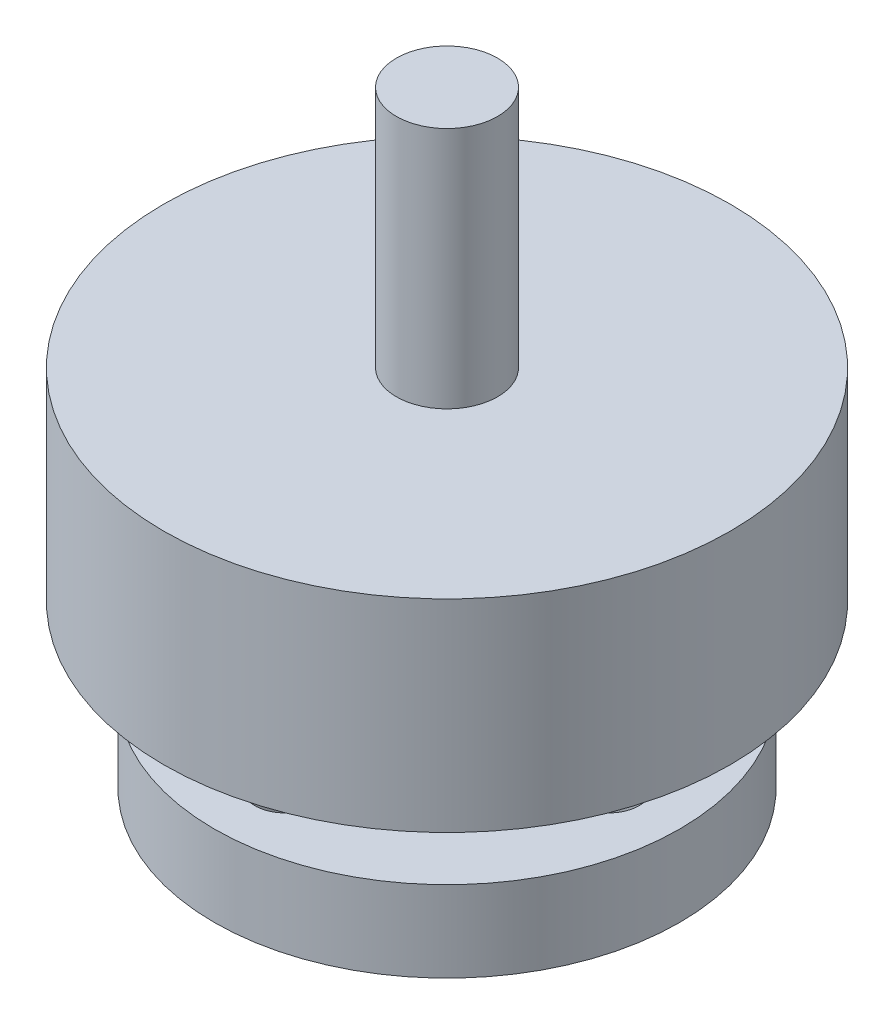
ISO-10303-21;
HEADER;
FILE_DESCRIPTION(('STEP AP214'),'2;1');
FILE_NAME('part.step','',(''),(''),'','','');
FILE_SCHEMA(('AUTOMOTIVE_DESIGN { 1 0 10303 214 1 1 1 1 }'));
ENDSEC;
DATA;
#1=APPLICATION_CONTEXT('core data for automotive mechanical design processes');
#2=APPLICATION_PROTOCOL_DEFINITION('international standard','automotive_design',2000,#1);
#3=PRODUCT_CONTEXT('',#1,'mechanical');
#4=PRODUCT('Part','Part','',(#3));
#5=PRODUCT_RELATED_PRODUCT_CATEGORY('part','',(#4));
#6=PRODUCT_DEFINITION_FORMATION('','',#4);
#7=PRODUCT_DEFINITION_CONTEXT('part definition',#1,'design');
#8=PRODUCT_DEFINITION('design','',#6,#7);
#9=PRODUCT_DEFINITION_SHAPE('','',#8);
#10=(LENGTH_UNIT() NAMED_UNIT(*) SI_UNIT(.MILLI.,.METRE.));
#11=(NAMED_UNIT(*) PLANE_ANGLE_UNIT() SI_UNIT($,.RADIAN.));
#12=(NAMED_UNIT(*) SI_UNIT($,.STERADIAN.) SOLID_ANGLE_UNIT());
#13=UNCERTAINTY_MEASURE_WITH_UNIT(LENGTH_MEASURE(1.E-05),#10,'distance_accuracy_value','');
#14=(GEOMETRIC_REPRESENTATION_CONTEXT(3) GLOBAL_UNCERTAINTY_ASSIGNED_CONTEXT((#13)) GLOBAL_UNIT_ASSIGNED_CONTEXT((#10,
#11,#12)) REPRESENTATION_CONTEXT('',''));
#15=CARTESIAN_POINT('',(0.,0.,0.));
#16=DIRECTION('',(0.,0.,1.));
#17=DIRECTION('',(1.,0.,0.));
#18=AXIS2_PLACEMENT_3D('',#15,#16,#17);
#19=CARTESIAN_POINT('',(0.,30.,0.));
#20=DIRECTION('',(0.,1.,0.));
#21=DIRECTION('',(0.,0.,1.));
#22=AXIS2_PLACEMENT_3D('',#19,#20,#21);
#23=PLANE('',#22);
#24=CARTESIAN_POINT('',(0.,30.,0.));
#25=DIRECTION('',(0.,-1.,0.));
#26=DIRECTION('',(0.,0.,-1.));
#27=AXIS2_PLACEMENT_3D('',#24,#25,#26);
#28=CIRCLE('',#27,2.5);
#29=CARTESIAN_POINT('',(0.,30.,-2.5));
#30=VERTEX_POINT('',#29);
#31=EDGE_CURVE('E10',#30,#30,#28,.T.);
#32=ORIENTED_EDGE('',*,*,#31,.F.);
#33=EDGE_LOOP('',(#32));
#34=FACE_BOUND('',#33,.T.);
#35=ADVANCED_FACE('F30',(#34),#23,.T.);
#36=CARTESIAN_POINT('',(0.,0.,0.));
#37=DIRECTION('',(0.,-1.,0.));
#38=DIRECTION('',(0.,0.,-1.));
#39=AXIS2_PLACEMENT_3D('',#36,#37,#38);
#40=CYLINDRICAL_SURFACE('',#39,2.5);
#41=ORIENTED_EDGE('',*,*,#31,.T.);
#42=EDGE_LOOP('',(#41));
#43=FACE_BOUND('',#42,.T.);
#44=CARTESIAN_POINT('',(0.,18.,0.));
#45=DIRECTION('',(0.,-1.,0.));
#46=DIRECTION('',(0.,0.,-1.));
#47=AXIS2_PLACEMENT_3D('',#44,#45,#46);
#48=CIRCLE('',#47,2.5);
#49=CARTESIAN_POINT('',(0.,18.,-2.5));
#50=VERTEX_POINT('',#49);
#51=EDGE_CURVE('E36',#50,#50,#48,.T.);
#52=ORIENTED_EDGE('',*,*,#51,.F.);
#53=EDGE_LOOP('',(#52));
#54=FACE_BOUND('',#53,.T.);
#55=ADVANCED_FACE('F119',(#43,#54),#40,.T.);
#56=CARTESIAN_POINT('',(2.5,18.,0.));
#57=DIRECTION('',(0.,1.,0.));
#58=DIRECTION('',(0.,0.,1.));
#59=AXIS2_PLACEMENT_3D('',#56,#57,#58);
#60=PLANE('',#59);
#61=ORIENTED_EDGE('',*,*,#51,.T.);
#62=EDGE_LOOP('',(#61));
#63=FACE_BOUND('',#62,.T.);
#64=CARTESIAN_POINT('',(0.,18.,0.));
#65=DIRECTION('',(0.,-1.,0.));
#66=DIRECTION('',(0.,0.,-1.));
#67=AXIS2_PLACEMENT_3D('',#64,#65,#66);
#68=CIRCLE('',#67,14.);
#69=CARTESIAN_POINT('',(0.,18.,-14.));
#70=VERTEX_POINT('',#69);
#71=EDGE_CURVE('E40',#70,#70,#68,.T.);
#72=ORIENTED_EDGE('',*,*,#71,.F.);
#73=EDGE_LOOP('',(#72));
#74=FACE_BOUND('',#73,.T.);
#75=ADVANCED_FACE('F124',(#63,#74),#60,.T.);
#76=CARTESIAN_POINT('',(0.,0.,0.));
#77=DIRECTION('',(0.,-1.,0.));
#78=DIRECTION('',(0.,0.,-1.));
#79=AXIS2_PLACEMENT_3D('',#76,#77,#78);
#80=CYLINDRICAL_SURFACE('',#79,14.);
#81=ORIENTED_EDGE('',*,*,#71,.T.);
#82=EDGE_LOOP('',(#81));
#83=FACE_BOUND('',#82,.T.);
#84=CARTESIAN_POINT('',(0.,8.,0.));
#85=DIRECTION('',(0.,-1.,0.));
#86=DIRECTION('',(0.,0.,-1.));
#87=AXIS2_PLACEMENT_3D('',#84,#85,#86);
#88=CIRCLE('',#87,14.);
#89=CARTESIAN_POINT('',(0.,8.,-14.));
#90=VERTEX_POINT('',#89);
#91=EDGE_CURVE('E44',#90,#90,#88,.T.);
#92=ORIENTED_EDGE('',*,*,#91,.F.);
#93=EDGE_LOOP('',(#92));
#94=FACE_BOUND('',#93,.T.);
#95=ADVANCED_FACE('F128',(#83,#94),#80,.T.);
#96=CARTESIAN_POINT('',(14.,8.,0.));
#97=DIRECTION('',(0.,-1.,0.));
#98=DIRECTION('',(0.,0.,-1.));
#99=AXIS2_PLACEMENT_3D('',#96,#97,#98);
#100=PLANE('',#99);
#101=ORIENTED_EDGE('',*,*,#91,.T.);
#102=EDGE_LOOP('',(#101));
#103=FACE_BOUND('',#102,.T.);
#104=CARTESIAN_POINT('',(0.,8.,0.));
#105=DIRECTION('',(0.,-1.,0.));
#106=DIRECTION('',(0.,0.,-1.));
#107=AXIS2_PLACEMENT_3D('',#104,#105,#106);
#108=CIRCLE('',#107,5.5);
#109=CARTESIAN_POINT('',(0.,8.,-5.5));
#110=VERTEX_POINT('',#109);
#111=EDGE_CURVE('E49',#110,#110,#108,.T.);
#112=ORIENTED_EDGE('',*,*,#111,.F.);
#113=EDGE_LOOP('',(#112));
#114=FACE_BOUND('',#113,.T.);
#115=ADVANCED_FACE('F134',(#103,#114),#100,.T.);
#116=CARTESIAN_POINT('',(0.,0.,0.));
#117=DIRECTION('',(0.,-1.,0.));
#118=DIRECTION('',(0.,0.,-1.));
#119=AXIS2_PLACEMENT_3D('',#116,#117,#118);
#120=CYLINDRICAL_SURFACE('',#119,5.5);
#121=ORIENTED_EDGE('',*,*,#111,.T.);
#122=EDGE_LOOP('',(#121));
#123=FACE_BOUND('',#122,.T.);
#124=CARTESIAN_POINT('',(0.,4.,0.));
#125=DIRECTION('',(0.,-1.,0.));
#126=DIRECTION('',(0.,0.,-1.));
#127=AXIS2_PLACEMENT_3D('',#124,#125,#126);
#128=CIRCLE('',#127,5.5);
#129=CARTESIAN_POINT('',(0.,4.,-5.5));
#130=VERTEX_POINT('',#129);
#131=EDGE_CURVE('E52',#130,#130,#128,.T.);
#132=ORIENTED_EDGE('',*,*,#131,.F.);
#133=EDGE_LOOP('',(#132));
#134=FACE_BOUND('',#133,.T.);
#135=ADVANCED_FACE('F116',(#123,#134),#120,.T.);
#136=CARTESIAN_POINT('',(5.5,4.,0.));
#137=DIRECTION('',(0.,1.,0.));
#138=DIRECTION('',(0.,0.,1.));
#139=AXIS2_PLACEMENT_3D('',#136,#137,#138);
#140=PLANE('',#139);
#141=CARTESIAN_POINT('',(0.,4.,8.));
#142=DIRECTION('',(0.,-1.,0.));
#143=DIRECTION('',(0.,0.,-1.));
#144=AXIS2_PLACEMENT_3D('',#141,#142,#143);
#145=CIRCLE('',#144,1.5);
#146=CARTESIAN_POINT('',(0.,4.,6.5));
#147=VERTEX_POINT('',#146);
#148=EDGE_CURVE('E61',#147,#147,#145,.T.);
#149=ORIENTED_EDGE('',*,*,#148,.T.);
#150=EDGE_LOOP('',(#149));
#151=FACE_BOUND('',#150,.T.);
#152=CARTESIAN_POINT('',(8.,4.,0.));
#153=DIRECTION('',(0.,-1.,0.));
#154=DIRECTION('',(0.,0.,-1.));
#155=AXIS2_PLACEMENT_3D('',#152,#153,#154);
#156=CIRCLE('',#155,1.5);
#157=CARTESIAN_POINT('',(8.,4.,-1.5));
#158=VERTEX_POINT('',#157);
#159=EDGE_CURVE('E77',#158,#158,#156,.T.);
#160=ORIENTED_EDGE('',*,*,#159,.T.);
#161=EDGE_LOOP('',(#160));
#162=FACE_BOUND('',#161,.T.);
#163=CARTESIAN_POINT('',(0.,4.,-8.));
#164=DIRECTION('',(0.,-1.,0.));
#165=DIRECTION('',(0.,0.,-1.));
#166=AXIS2_PLACEMENT_3D('',#163,#164,#165);
#167=CIRCLE('',#166,1.5);
#168=CARTESIAN_POINT('',(0.,4.,-9.5));
#169=VERTEX_POINT('',#168);
#170=EDGE_CURVE('E71',#169,#169,#167,.T.);
#171=ORIENTED_EDGE('',*,*,#170,.T.);
#172=EDGE_LOOP('',(#171));
#173=FACE_BOUND('',#172,.T.);
#174=CARTESIAN_POINT('',(-8.,4.,0.));
#175=DIRECTION('',(0.,-1.,0.));
#176=DIRECTION('',(0.,0.,-1.));
#177=AXIS2_PLACEMENT_3D('',#174,#175,#176);
#178=CIRCLE('',#177,1.5);
#179=CARTESIAN_POINT('',(-8.,4.,-1.5));
#180=VERTEX_POINT('',#179);
#181=EDGE_CURVE('E65',#180,#180,#178,.T.);
#182=ORIENTED_EDGE('',*,*,#181,.T.);
#183=EDGE_LOOP('',(#182));
#184=FACE_BOUND('',#183,.T.);
#185=ORIENTED_EDGE('',*,*,#131,.T.);
#186=EDGE_LOOP('',(#185));
#187=FACE_BOUND('',#186,.T.);
#188=CARTESIAN_POINT('',(0.,4.,0.));
#189=DIRECTION('',(0.,-1.,0.));
#190=DIRECTION('',(0.,0.,-1.));
#191=AXIS2_PLACEMENT_3D('',#188,#189,#190);
#192=CIRCLE('',#191,11.5);
#193=CARTESIAN_POINT('',(0.,4.,-11.5));
#194=VERTEX_POINT('',#193);
#195=EDGE_CURVE('E55',#194,#194,#192,.T.);
#196=ORIENTED_EDGE('',*,*,#195,.F.);
#197=EDGE_LOOP('',(#196));
#198=FACE_BOUND('',#197,.T.);
#199=ADVANCED_FACE('F86',(#151,#162,#173,#184,#187,#198),#140,.T.);
#200=CARTESIAN_POINT('',(0.,0.,0.));
#201=DIRECTION('',(0.,-1.,0.));
#202=DIRECTION('',(0.,0.,-1.));
#203=AXIS2_PLACEMENT_3D('',#200,#201,#202);
#204=CYLINDRICAL_SURFACE('',#203,11.5);
#205=ORIENTED_EDGE('',*,*,#195,.T.);
#206=EDGE_LOOP('',(#205));
#207=FACE_BOUND('',#206,.T.);
#208=CARTESIAN_POINT('',(0.,0.,0.));
#209=DIRECTION('',(0.,-1.,0.));
#210=DIRECTION('',(0.,0.,-1.));
#211=AXIS2_PLACEMENT_3D('',#208,#209,#210);
#212=CIRCLE('',#211,11.5);
#213=CARTESIAN_POINT('',(0.,0.,-11.5));
#214=VERTEX_POINT('',#213);
#215=EDGE_CURVE('E58',#214,#214,#212,.T.);
#216=ORIENTED_EDGE('',*,*,#215,.F.);
#217=EDGE_LOOP('',(#216));
#218=FACE_BOUND('',#217,.T.);
#219=ADVANCED_FACE('F100',(#207,#218),#204,.T.);
#220=CARTESIAN_POINT('',(11.5,0.,0.));
#221=DIRECTION('',(0.,-1.,0.));
#222=DIRECTION('',(0.,0.,-1.));
#223=AXIS2_PLACEMENT_3D('',#220,#221,#222);
#224=PLANE('',#223);
#225=CARTESIAN_POINT('',(0.,0.,8.));
#226=DIRECTION('',(0.,-1.,0.));
#227=DIRECTION('',(0.,0.,-1.));
#228=AXIS2_PLACEMENT_3D('',#225,#226,#227);
#229=CIRCLE('',#228,1.5);
#230=CARTESIAN_POINT('',(0.,0.,6.5));
#231=VERTEX_POINT('',#230);
#232=EDGE_CURVE('E80',#231,#231,#229,.T.);
#233=ORIENTED_EDGE('',*,*,#232,.F.);
#234=EDGE_LOOP('',(#233));
#235=FACE_BOUND('',#234,.T.);
#236=CARTESIAN_POINT('',(8.,0.,0.));
#237=DIRECTION('',(0.,-1.,0.));
#238=DIRECTION('',(0.,0.,-1.));
#239=AXIS2_PLACEMENT_3D('',#236,#237,#238);
#240=CIRCLE('',#239,1.5);
#241=CARTESIAN_POINT('',(8.,0.,-1.5));
#242=VERTEX_POINT('',#241);
#243=EDGE_CURVE('E74',#242,#242,#240,.T.);
#244=ORIENTED_EDGE('',*,*,#243,.F.);
#245=EDGE_LOOP('',(#244));
#246=FACE_BOUND('',#245,.T.);
#247=CARTESIAN_POINT('',(0.,0.,-8.));
#248=DIRECTION('',(0.,-1.,0.));
#249=DIRECTION('',(0.,0.,-1.));
#250=AXIS2_PLACEMENT_3D('',#247,#248,#249);
#251=CIRCLE('',#250,1.5);
#252=CARTESIAN_POINT('',(0.,0.,-9.5));
#253=VERTEX_POINT('',#252);
#254=EDGE_CURVE('E68',#253,#253,#251,.T.);
#255=ORIENTED_EDGE('',*,*,#254,.F.);
#256=EDGE_LOOP('',(#255));
#257=FACE_BOUND('',#256,.T.);
#258=CARTESIAN_POINT('',(-8.,0.,0.));
#259=DIRECTION('',(0.,-1.,0.));
#260=DIRECTION('',(0.,0.,-1.));
#261=AXIS2_PLACEMENT_3D('',#258,#259,#260);
#262=CIRCLE('',#261,1.5);
#263=CARTESIAN_POINT('',(-8.,0.,-1.5));
#264=VERTEX_POINT('',#263);
#265=EDGE_CURVE('E62',#264,#264,#262,.T.);
#266=ORIENTED_EDGE('',*,*,#265,.F.);
#267=EDGE_LOOP('',(#266));
#268=FACE_BOUND('',#267,.T.);
#269=ORIENTED_EDGE('',*,*,#215,.T.);
#270=EDGE_LOOP('',(#269));
#271=FACE_BOUND('',#270,.T.);
#272=ADVANCED_FACE('F96',(#235,#246,#257,#268,#271),#224,.T.);
#273=CARTESIAN_POINT('',(-8.,4.,0.));
#274=DIRECTION('',(0.,-1.,0.));
#275=DIRECTION('',(0.,0.,-1.));
#276=AXIS2_PLACEMENT_3D('',#273,#274,#275);
#277=CYLINDRICAL_SURFACE('',#276,1.5);
#278=ORIENTED_EDGE('',*,*,#181,.F.);
#279=EDGE_LOOP('',(#278));
#280=FACE_BOUND('',#279,.T.);
#281=ORIENTED_EDGE('',*,*,#265,.T.);
#282=EDGE_LOOP('',(#281));
#283=FACE_BOUND('',#282,.T.);
#284=ADVANCED_FACE('F99',(#280,#283),#277,.F.);
#285=CARTESIAN_POINT('',(0.,4.,-8.));
#286=DIRECTION('',(0.,-1.,0.));
#287=DIRECTION('',(0.,0.,-1.));
#288=AXIS2_PLACEMENT_3D('',#285,#286,#287);
#289=CYLINDRICAL_SURFACE('',#288,1.5);
#290=ORIENTED_EDGE('',*,*,#170,.F.);
#291=EDGE_LOOP('',(#290));
#292=FACE_BOUND('',#291,.T.);
#293=ORIENTED_EDGE('',*,*,#254,.T.);
#294=EDGE_LOOP('',(#293));
#295=FACE_BOUND('',#294,.T.);
#296=ADVANCED_FACE('F173',(#292,#295),#289,.F.);
#297=CARTESIAN_POINT('',(8.,4.,0.));
#298=DIRECTION('',(0.,-1.,0.));
#299=DIRECTION('',(0.,0.,-1.));
#300=AXIS2_PLACEMENT_3D('',#297,#298,#299);
#301=CYLINDRICAL_SURFACE('',#300,1.5);
#302=ORIENTED_EDGE('',*,*,#159,.F.);
#303=EDGE_LOOP('',(#302));
#304=FACE_BOUND('',#303,.T.);
#305=ORIENTED_EDGE('',*,*,#243,.T.);
#306=EDGE_LOOP('',(#305));
#307=FACE_BOUND('',#306,.T.);
#308=ADVANCED_FACE('F92',(#304,#307),#301,.F.);
#309=CARTESIAN_POINT('',(0.,4.,8.));
#310=DIRECTION('',(0.,-1.,0.));
#311=DIRECTION('',(0.,0.,-1.));
#312=AXIS2_PLACEMENT_3D('',#309,#310,#311);
#313=CYLINDRICAL_SURFACE('',#312,1.5);
#314=ORIENTED_EDGE('',*,*,#148,.F.);
#315=EDGE_LOOP('',(#314));
#316=FACE_BOUND('',#315,.T.);
#317=ORIENTED_EDGE('',*,*,#232,.T.);
#318=EDGE_LOOP('',(#317));
#319=FACE_BOUND('',#318,.T.);
#320=ADVANCED_FACE('F89',(#316,#319),#313,.F.);
#321=CLOSED_SHELL('',(#35,#55,#75,#95,#115,#135,#199,#219,#272,#284,#296,#308,#320));
#322=MANIFOLD_SOLID_BREP('B2',#321);
#323=ADVANCED_BREP_SHAPE_REPRESENTATION('',(#18,#322),#14);
#324=SHAPE_DEFINITION_REPRESENTATION(#9,#323);
ENDSEC;
END-ISO-10303-21;
